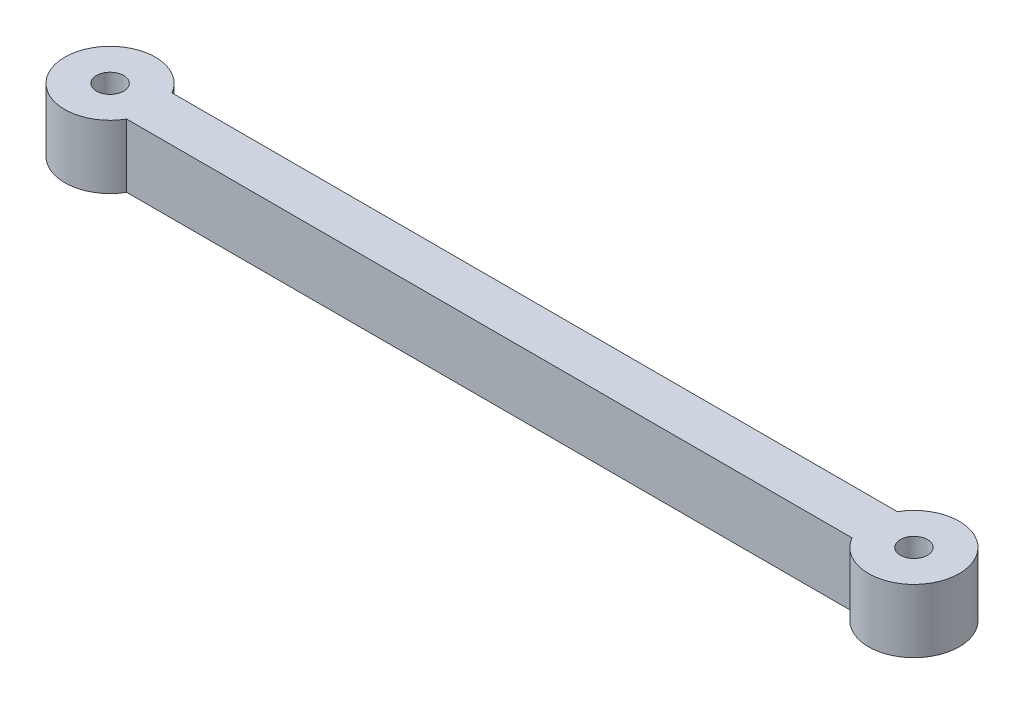
ISO-10303-21;
HEADER;
FILE_DESCRIPTION(('STEP AP214'),'2;1');
FILE_NAME('part.step','',(''),(''),'','','');
FILE_SCHEMA(('AUTOMOTIVE_DESIGN { 1 0 10303 214 1 1 1 1 }'));
ENDSEC;
DATA;
#1=APPLICATION_CONTEXT('core data for automotive mechanical design processes');
#2=APPLICATION_PROTOCOL_DEFINITION('international standard','automotive_design',2000,#1);
#3=PRODUCT_CONTEXT('',#1,'mechanical');
#4=PRODUCT('Part','Part','',(#3));
#5=PRODUCT_RELATED_PRODUCT_CATEGORY('part','',(#4));
#6=PRODUCT_DEFINITION_FORMATION('','',#4);
#7=PRODUCT_DEFINITION_CONTEXT('part definition',#1,'design');
#8=PRODUCT_DEFINITION('design','',#6,#7);
#9=PRODUCT_DEFINITION_SHAPE('','',#8);
#10=(LENGTH_UNIT() NAMED_UNIT(*) SI_UNIT(.MILLI.,.METRE.));
#11=(NAMED_UNIT(*) PLANE_ANGLE_UNIT() SI_UNIT($,.RADIAN.));
#12=(NAMED_UNIT(*) SI_UNIT($,.STERADIAN.) SOLID_ANGLE_UNIT());
#13=UNCERTAINTY_MEASURE_WITH_UNIT(LENGTH_MEASURE(1.E-05),#10,'distance_accuracy_value','');
#14=(GEOMETRIC_REPRESENTATION_CONTEXT(3) GLOBAL_UNCERTAINTY_ASSIGNED_CONTEXT((#13)) GLOBAL_UNIT_ASSIGNED_CONTEXT((#10,
#11,#12)) REPRESENTATION_CONTEXT('',''));
#15=CARTESIAN_POINT('',(0.,0.,0.));
#16=DIRECTION('',(0.,0.,1.));
#17=DIRECTION('',(1.,0.,0.));
#18=AXIS2_PLACEMENT_3D('',#15,#16,#17);
#19=CARTESIAN_POINT('',(-44.3301270189222,7.,0.));
#20=DIRECTION('',(0.,-1.,0.));
#21=DIRECTION('',(0.,0.,-1.));
#22=AXIS2_PLACEMENT_3D('',#19,#20,#21);
#23=CYLINDRICAL_SURFACE('',#22,5.);
#24=CARTESIAN_POINT('',(-44.3301270189222,0.,0.));
#25=DIRECTION('',(0.,1.,0.));
#26=DIRECTION('',(0.,0.,1.));
#27=AXIS2_PLACEMENT_3D('',#24,#25,#26);
#28=CIRCLE('',#27,5.);
#29=CARTESIAN_POINT('',(-40.,0.,-2.5));
#30=VERTEX_POINT('',#29);
#31=CARTESIAN_POINT('',(-40.,0.,2.5));
#32=VERTEX_POINT('',#31);
#33=EDGE_CURVE('E95',#30,#32,#28,.T.);
#34=ORIENTED_EDGE('',*,*,#33,.T.);
#35=DIRECTION('',(0.,-1.,0.));
#36=VECTOR('',#35,1.);
#37=CARTESIAN_POINT('',(-40.,7.,2.5));
#38=LINE('',#37,#36);
#39=CARTESIAN_POINT('',(-40.,7.,2.5));
#40=VERTEX_POINT('',#39);
#41=EDGE_CURVE('E11',#40,#32,#38,.T.);
#42=ORIENTED_EDGE('',*,*,#41,.F.);
#43=CARTESIAN_POINT('',(-44.3301270189222,7.,0.));
#44=DIRECTION('',(0.,1.,0.));
#45=DIRECTION('',(0.,0.,1.));
#46=AXIS2_PLACEMENT_3D('',#43,#44,#45);
#47=CIRCLE('',#46,5.);
#48=CARTESIAN_POINT('',(-40.,7.,-2.5));
#49=VERTEX_POINT('',#48);
#50=EDGE_CURVE('E83',#49,#40,#47,.T.);
#51=ORIENTED_EDGE('',*,*,#50,.F.);
#52=DIRECTION('',(0.,-1.,0.));
#53=VECTOR('',#52,1.);
#54=CARTESIAN_POINT('',(-40.,7.,-2.5));
#55=LINE('',#54,#53);
#56=EDGE_CURVE('E91',#49,#30,#55,.T.);
#57=ORIENTED_EDGE('',*,*,#56,.T.);
#58=EDGE_LOOP('',(#34,#42,#51,#57));
#59=FACE_BOUND('',#58,.T.);
#60=ADVANCED_FACE('F32',(#59),#23,.T.);
#61=CARTESIAN_POINT('',(-40.,7.,2.5));
#62=DIRECTION('',(0.,0.,-1.));
#63=DIRECTION('',(-1.,0.,0.));
#64=AXIS2_PLACEMENT_3D('',#61,#62,#63);
#65=PLANE('',#64);
#66=DIRECTION('',(1.,0.,0.));
#67=VECTOR('',#66,1.);
#68=CARTESIAN_POINT('',(-40.,0.,2.5));
#69=LINE('',#68,#67);
#70=CARTESIAN_POINT('',(40.,0.,2.50000000000001));
#71=VERTEX_POINT('',#70);
#72=EDGE_CURVE('E87',#32,#71,#69,.T.);
#73=ORIENTED_EDGE('',*,*,#72,.T.);
#74=DIRECTION('',(0.,-1.,0.));
#75=VECTOR('',#74,1.);
#76=CARTESIAN_POINT('',(40.,7.,2.50000000000001));
#77=LINE('',#76,#75);
#78=CARTESIAN_POINT('',(40.,7.,2.50000000000001));
#79=VERTEX_POINT('',#78);
#80=EDGE_CURVE('E40',#79,#71,#77,.T.);
#81=ORIENTED_EDGE('',*,*,#80,.F.);
#82=DIRECTION('',(1.,0.,0.));
#83=VECTOR('',#82,1.);
#84=CARTESIAN_POINT('',(-40.,7.,2.5));
#85=LINE('',#84,#83);
#86=EDGE_CURVE('E78',#40,#79,#85,.T.);
#87=ORIENTED_EDGE('',*,*,#86,.F.);
#88=ORIENTED_EDGE('',*,*,#41,.T.);
#89=EDGE_LOOP('',(#73,#81,#87,#88));
#90=FACE_BOUND('',#89,.T.);
#91=ADVANCED_FACE('F86',(#90),#65,.F.);
#92=CARTESIAN_POINT('',(44.3301270189222,7.,0.));
#93=DIRECTION('',(0.,-1.,0.));
#94=DIRECTION('',(0.,0.,-1.));
#95=AXIS2_PLACEMENT_3D('',#92,#93,#94);
#96=CYLINDRICAL_SURFACE('',#95,5.);
#97=CARTESIAN_POINT('',(44.3301270189222,0.,0.));
#98=DIRECTION('',(0.,1.,0.));
#99=DIRECTION('',(0.,0.,-1.));
#100=AXIS2_PLACEMENT_3D('',#97,#98,#99);
#101=CIRCLE('',#100,5.);
#102=CARTESIAN_POINT('',(40.,0.,-2.5));
#103=VERTEX_POINT('',#102);
#104=EDGE_CURVE('E65',#71,#103,#101,.T.);
#105=ORIENTED_EDGE('',*,*,#104,.T.);
#106=DIRECTION('',(0.,-1.,0.));
#107=VECTOR('',#106,1.);
#108=CARTESIAN_POINT('',(40.,7.,-2.5));
#109=LINE('',#108,#107);
#110=CARTESIAN_POINT('',(40.,7.,-2.5));
#111=VERTEX_POINT('',#110);
#112=EDGE_CURVE('E88',#111,#103,#109,.T.);
#113=ORIENTED_EDGE('',*,*,#112,.F.);
#114=CARTESIAN_POINT('',(44.3301270189222,7.,0.));
#115=DIRECTION('',(0.,1.,0.));
#116=DIRECTION('',(0.,0.,-1.));
#117=AXIS2_PLACEMENT_3D('',#114,#115,#116);
#118=CIRCLE('',#117,5.);
#119=EDGE_CURVE('E81',#79,#111,#118,.T.);
#120=ORIENTED_EDGE('',*,*,#119,.F.);
#121=ORIENTED_EDGE('',*,*,#80,.T.);
#122=EDGE_LOOP('',(#105,#113,#120,#121));
#123=FACE_BOUND('',#122,.T.);
#124=ADVANCED_FACE('F89',(#123),#96,.T.);
#125=CARTESIAN_POINT('',(-40.,7.,-2.5));
#126=DIRECTION('',(0.,0.,1.));
#127=DIRECTION('',(1.,0.,0.));
#128=AXIS2_PLACEMENT_3D('',#125,#126,#127);
#129=PLANE('',#128);
#130=DIRECTION('',(-1.,0.,0.));
#131=VECTOR('',#130,1.);
#132=CARTESIAN_POINT('',(-40.,0.,-2.5));
#133=LINE('',#132,#131);
#134=EDGE_CURVE('E71',#103,#30,#133,.T.);
#135=ORIENTED_EDGE('',*,*,#134,.T.);
#136=ORIENTED_EDGE('',*,*,#56,.F.);
#137=DIRECTION('',(-1.,0.,0.));
#138=VECTOR('',#137,1.);
#139=CARTESIAN_POINT('',(-40.,7.,-2.5));
#140=LINE('',#139,#138);
#141=EDGE_CURVE('E48',#111,#49,#140,.T.);
#142=ORIENTED_EDGE('',*,*,#141,.F.);
#143=ORIENTED_EDGE('',*,*,#112,.T.);
#144=EDGE_LOOP('',(#135,#136,#142,#143));
#145=FACE_BOUND('',#144,.T.);
#146=ADVANCED_FACE('F103',(#145),#129,.F.);
#147=CARTESIAN_POINT('',(-44.3301270189222,7.,0.));
#148=DIRECTION('',(0.,1.,0.));
#149=DIRECTION('',(0.,0.,1.));
#150=AXIS2_PLACEMENT_3D('',#147,#148,#149);
#151=PLANE('',#150);
#152=CARTESIAN_POINT('',(-44.3301270189222,7.,0.));
#153=DIRECTION('',(0.,1.,0.));
#154=DIRECTION('',(0.,0.,1.));
#155=AXIS2_PLACEMENT_3D('',#152,#153,#154);
#156=CIRCLE('',#155,1.5);
#157=CARTESIAN_POINT('',(-44.3301270189222,7.,1.5));
#158=VERTEX_POINT('',#157);
#159=EDGE_CURVE('E115',#158,#158,#156,.T.);
#160=ORIENTED_EDGE('',*,*,#159,.F.);
#161=EDGE_LOOP('',(#160));
#162=FACE_BOUND('',#161,.T.);
#163=CARTESIAN_POINT('',(44.3301270189222,7.,0.));
#164=DIRECTION('',(0.,1.,0.));
#165=DIRECTION('',(0.,0.,1.));
#166=AXIS2_PLACEMENT_3D('',#163,#164,#165);
#167=CIRCLE('',#166,1.5);
#168=CARTESIAN_POINT('',(44.3301270189222,7.,1.5));
#169=VERTEX_POINT('',#168);
#170=EDGE_CURVE('E109',#169,#169,#167,.T.);
#171=ORIENTED_EDGE('',*,*,#170,.F.);
#172=EDGE_LOOP('',(#171));
#173=FACE_BOUND('',#172,.T.);
#174=ORIENTED_EDGE('',*,*,#50,.T.);
#175=ORIENTED_EDGE('',*,*,#86,.T.);
#176=ORIENTED_EDGE('',*,*,#119,.T.);
#177=ORIENTED_EDGE('',*,*,#141,.T.);
#178=EDGE_LOOP('',(#174,#175,#176,#177));
#179=FACE_BOUND('',#178,.T.);
#180=ADVANCED_FACE('F79',(#162,#173,#179),#151,.T.);
#181=CARTESIAN_POINT('',(-44.3301270189222,0.,0.));
#182=DIRECTION('',(0.,1.,0.));
#183=DIRECTION('',(0.,0.,1.));
#184=AXIS2_PLACEMENT_3D('',#181,#182,#183);
#185=PLANE('',#184);
#186=CARTESIAN_POINT('',(-44.3301270189222,0.,0.));
#187=DIRECTION('',(0.,1.,0.));
#188=DIRECTION('',(0.,0.,1.));
#189=AXIS2_PLACEMENT_3D('',#186,#187,#188);
#190=CIRCLE('',#189,1.5);
#191=CARTESIAN_POINT('',(-44.3301270189222,0.,1.5));
#192=VERTEX_POINT('',#191);
#193=EDGE_CURVE('E98',#192,#192,#190,.T.);
#194=ORIENTED_EDGE('',*,*,#193,.T.);
#195=EDGE_LOOP('',(#194));
#196=FACE_BOUND('',#195,.T.);
#197=CARTESIAN_POINT('',(44.3301270189222,0.,0.));
#198=DIRECTION('',(0.,1.,0.));
#199=DIRECTION('',(0.,0.,1.));
#200=AXIS2_PLACEMENT_3D('',#197,#198,#199);
#201=CIRCLE('',#200,1.5);
#202=CARTESIAN_POINT('',(44.3301270189222,0.,1.5));
#203=VERTEX_POINT('',#202);
#204=EDGE_CURVE('E112',#203,#203,#201,.T.);
#205=ORIENTED_EDGE('',*,*,#204,.T.);
#206=EDGE_LOOP('',(#205));
#207=FACE_BOUND('',#206,.T.);
#208=ORIENTED_EDGE('',*,*,#33,.F.);
#209=ORIENTED_EDGE('',*,*,#134,.F.);
#210=ORIENTED_EDGE('',*,*,#104,.F.);
#211=ORIENTED_EDGE('',*,*,#72,.F.);
#212=EDGE_LOOP('',(#208,#209,#210,#211));
#213=FACE_BOUND('',#212,.T.);
#214=ADVANCED_FACE('F106',(#196,#207,#213),#185,.F.);
#215=CARTESIAN_POINT('',(44.3301270189222,0.,0.));
#216=DIRECTION('',(0.,1.,0.));
#217=DIRECTION('',(0.,0.,1.));
#218=AXIS2_PLACEMENT_3D('',#215,#216,#217);
#219=CYLINDRICAL_SURFACE('',#218,1.5);
#220=ORIENTED_EDGE('',*,*,#204,.F.);
#221=EDGE_LOOP('',(#220));
#222=FACE_BOUND('',#221,.T.);
#223=ORIENTED_EDGE('',*,*,#170,.T.);
#224=EDGE_LOOP('',(#223));
#225=FACE_BOUND('',#224,.T.);
#226=ADVANCED_FACE('F126',(#222,#225),#219,.F.);
#227=CARTESIAN_POINT('',(-44.3301270189222,0.,0.));
#228=DIRECTION('',(0.,1.,0.));
#229=DIRECTION('',(0.,0.,1.));
#230=AXIS2_PLACEMENT_3D('',#227,#228,#229);
#231=CYLINDRICAL_SURFACE('',#230,1.5);
#232=ORIENTED_EDGE('',*,*,#193,.F.);
#233=EDGE_LOOP('',(#232));
#234=FACE_BOUND('',#233,.T.);
#235=ORIENTED_EDGE('',*,*,#159,.T.);
#236=EDGE_LOOP('',(#235));
#237=FACE_BOUND('',#236,.T.);
#238=ADVANCED_FACE('F123',(#234,#237),#231,.F.);
#239=CLOSED_SHELL('',(#60,#91,#124,#146,#180,#214,#226,#238));
#240=MANIFOLD_SOLID_BREP('B2',#239);
#241=ADVANCED_BREP_SHAPE_REPRESENTATION('',(#18,#240),#14);
#242=SHAPE_DEFINITION_REPRESENTATION(#9,#241);
ENDSEC;
END-ISO-10303-21;
